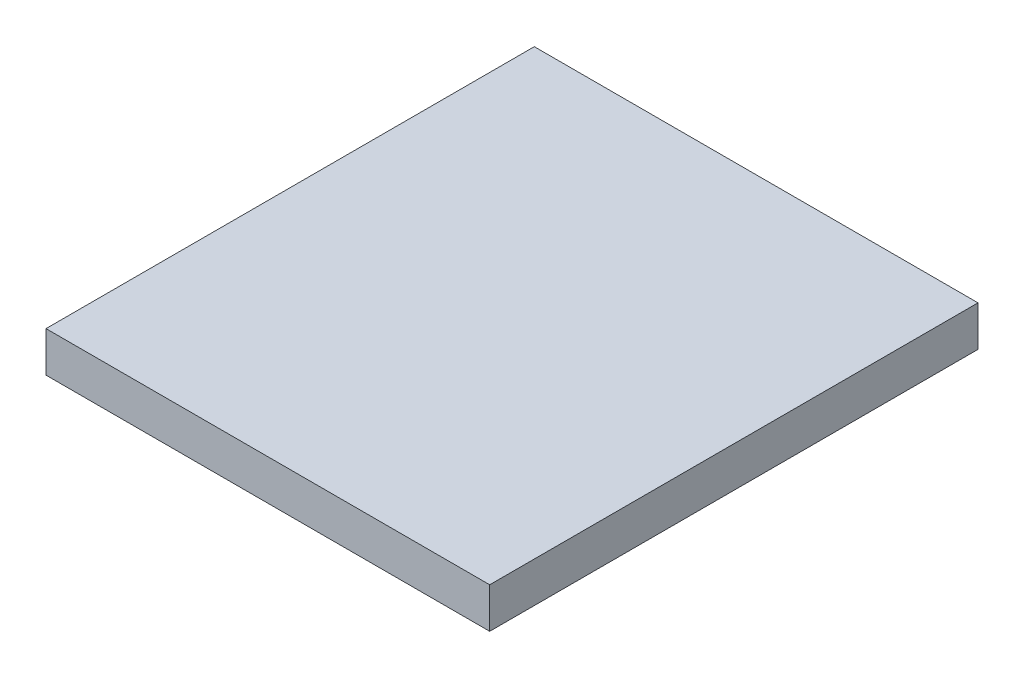
ISO-10303-21;
HEADER;
FILE_DESCRIPTION(('STEP AP214'),'2;1');
FILE_NAME('part.step','',(''),(''),'','','');
FILE_SCHEMA(('AUTOMOTIVE_DESIGN { 1 0 10303 214 1 1 1 1 }'));
ENDSEC;
DATA;
#1=APPLICATION_CONTEXT('core data for automotive mechanical design processes');
#2=APPLICATION_PROTOCOL_DEFINITION('international standard','automotive_design',2000,#1);
#3=PRODUCT_CONTEXT('',#1,'mechanical');
#4=PRODUCT('Part','Part','',(#3));
#5=PRODUCT_RELATED_PRODUCT_CATEGORY('part','',(#4));
#6=PRODUCT_DEFINITION_FORMATION('','',#4);
#7=PRODUCT_DEFINITION_CONTEXT('part definition',#1,'design');
#8=PRODUCT_DEFINITION('design','',#6,#7);
#9=PRODUCT_DEFINITION_SHAPE('','',#8);
#10=(LENGTH_UNIT() NAMED_UNIT(*) SI_UNIT(.MILLI.,.METRE.));
#11=(NAMED_UNIT(*) PLANE_ANGLE_UNIT() SI_UNIT($,.RADIAN.));
#12=(NAMED_UNIT(*) SI_UNIT($,.STERADIAN.) SOLID_ANGLE_UNIT());
#13=UNCERTAINTY_MEASURE_WITH_UNIT(LENGTH_MEASURE(1.E-05),#10,'distance_accuracy_value','');
#14=(GEOMETRIC_REPRESENTATION_CONTEXT(3) GLOBAL_UNCERTAINTY_ASSIGNED_CONTEXT((#13)) GLOBAL_UNIT_ASSIGNED_CONTEXT((#10,
#11,#12)) REPRESENTATION_CONTEXT('',''));
#15=CARTESIAN_POINT('',(0.,0.,0.));
#16=DIRECTION('',(0.,0.,1.));
#17=DIRECTION('',(1.,0.,0.));
#18=AXIS2_PLACEMENT_3D('',#15,#16,#17);
#19=CARTESIAN_POINT('',(54.497363485,9.906,59.977362045));
#20=DIRECTION('',(-1.,0.,0.));
#21=DIRECTION('',(0.,0.,1.));
#22=AXIS2_PLACEMENT_3D('',#19,#20,#21);
#23=PLANE('',#22);
#24=DIRECTION('',(0.,0.,-1.));
#25=VECTOR('',#24,1.);
#26=CARTESIAN_POINT('',(54.497363485,0.,59.977362045));
#27=LINE('',#26,#25);
#28=CARTESIAN_POINT('',(54.497363485,0.,59.977362045));
#29=VERTEX_POINT('',#28);
#30=CARTESIAN_POINT('',(54.497363485,0.,-59.977362045));
#31=VERTEX_POINT('',#30);
#32=EDGE_CURVE('E108',#29,#31,#27,.T.);
#33=ORIENTED_EDGE('',*,*,#32,.T.);
#34=DIRECTION('',(0.,-1.,0.));
#35=VECTOR('',#34,1.);
#36=CARTESIAN_POINT('',(54.497363485,9.906,-59.977362045));
#37=LINE('',#36,#35);
#38=CARTESIAN_POINT('',(54.497363485,9.906,-59.977362045));
#39=VERTEX_POINT('',#38);
#40=EDGE_CURVE('E11',#39,#31,#37,.T.);
#41=ORIENTED_EDGE('',*,*,#40,.F.);
#42=DIRECTION('',(0.,0.,-1.));
#43=VECTOR('',#42,1.);
#44=CARTESIAN_POINT('',(54.497363485,9.906,59.977362045));
#45=LINE('',#44,#43);
#46=CARTESIAN_POINT('',(54.497363485,9.906,59.977362045));
#47=VERTEX_POINT('',#46);
#48=EDGE_CURVE('E96',#47,#39,#45,.T.);
#49=ORIENTED_EDGE('',*,*,#48,.F.);
#50=DIRECTION('',(0.,-1.,0.));
#51=VECTOR('',#50,1.);
#52=CARTESIAN_POINT('',(54.497363485,9.906,59.977362045));
#53=LINE('',#52,#51);
#54=EDGE_CURVE('E104',#47,#29,#53,.T.);
#55=ORIENTED_EDGE('',*,*,#54,.T.);
#56=EDGE_LOOP('',(#33,#41,#49,#55));
#57=FACE_BOUND('',#56,.T.);
#58=ADVANCED_FACE('F45',(#57),#23,.F.);
#59=CARTESIAN_POINT('',(-54.497363485,9.906,-59.977362045));
#60=DIRECTION('',(0.,0.,1.));
#61=DIRECTION('',(1.,0.,0.));
#62=AXIS2_PLACEMENT_3D('',#59,#60,#61);
#63=PLANE('',#62);
#64=DIRECTION('',(-1.,0.,0.));
#65=VECTOR('',#64,1.);
#66=CARTESIAN_POINT('',(-54.497363485,0.,-59.977362045));
#67=LINE('',#66,#65);
#68=CARTESIAN_POINT('',(-54.497363485,0.,-59.977362045));
#69=VERTEX_POINT('',#68);
#70=EDGE_CURVE('E100',#31,#69,#67,.T.);
#71=ORIENTED_EDGE('',*,*,#70,.T.);
#72=DIRECTION('',(0.,-1.,0.));
#73=VECTOR('',#72,1.);
#74=CARTESIAN_POINT('',(-54.497363485,9.906,-59.977362045));
#75=LINE('',#74,#73);
#76=CARTESIAN_POINT('',(-54.497363485,9.906,-59.977362045));
#77=VERTEX_POINT('',#76);
#78=EDGE_CURVE('E53',#77,#69,#75,.T.);
#79=ORIENTED_EDGE('',*,*,#78,.F.);
#80=DIRECTION('',(-1.,0.,0.));
#81=VECTOR('',#80,1.);
#82=CARTESIAN_POINT('',(-54.497363485,9.906,-59.977362045));
#83=LINE('',#82,#81);
#84=EDGE_CURVE('E91',#39,#77,#83,.T.);
#85=ORIENTED_EDGE('',*,*,#84,.F.);
#86=ORIENTED_EDGE('',*,*,#40,.T.);
#87=EDGE_LOOP('',(#71,#79,#85,#86));
#88=FACE_BOUND('',#87,.T.);
#89=ADVANCED_FACE('F99',(#88),#63,.F.);
#90=CARTESIAN_POINT('',(-54.497363485,9.906,59.977362045));
#91=DIRECTION('',(1.,0.,0.));
#92=DIRECTION('',(0.,0.,-1.));
#93=AXIS2_PLACEMENT_3D('',#90,#91,#92);
#94=PLANE('',#93);
#95=DIRECTION('',(0.,0.,1.));
#96=VECTOR('',#95,1.);
#97=CARTESIAN_POINT('',(-54.497363485,0.,59.977362045));
#98=LINE('',#97,#96);
#99=CARTESIAN_POINT('',(-54.497363485,0.,59.977362045));
#100=VERTEX_POINT('',#99);
#101=EDGE_CURVE('E78',#69,#100,#98,.T.);
#102=ORIENTED_EDGE('',*,*,#101,.T.);
#103=DIRECTION('',(0.,-1.,0.));
#104=VECTOR('',#103,1.);
#105=CARTESIAN_POINT('',(-54.497363485,9.906,59.977362045));
#106=LINE('',#105,#104);
#107=CARTESIAN_POINT('',(-54.497363485,9.906,59.977362045));
#108=VERTEX_POINT('',#107);
#109=EDGE_CURVE('E101',#108,#100,#106,.T.);
#110=ORIENTED_EDGE('',*,*,#109,.F.);
#111=DIRECTION('',(0.,0.,1.));
#112=VECTOR('',#111,1.);
#113=CARTESIAN_POINT('',(-54.497363485,9.906,59.977362045));
#114=LINE('',#113,#112);
#115=EDGE_CURVE('E94',#77,#108,#114,.T.);
#116=ORIENTED_EDGE('',*,*,#115,.F.);
#117=ORIENTED_EDGE('',*,*,#78,.T.);
#118=EDGE_LOOP('',(#102,#110,#116,#117));
#119=FACE_BOUND('',#118,.T.);
#120=ADVANCED_FACE('F102',(#119),#94,.F.);
#121=CARTESIAN_POINT('',(-54.497363485,9.906,59.977362045));
#122=DIRECTION('',(0.,0.,-1.));
#123=DIRECTION('',(-1.,0.,0.));
#124=AXIS2_PLACEMENT_3D('',#121,#122,#123);
#125=PLANE('',#124);
#126=DIRECTION('',(1.,0.,0.));
#127=VECTOR('',#126,1.);
#128=CARTESIAN_POINT('',(-54.497363485,0.,59.977362045));
#129=LINE('',#128,#127);
#130=EDGE_CURVE('E84',#100,#29,#129,.T.);
#131=ORIENTED_EDGE('',*,*,#130,.T.);
#132=ORIENTED_EDGE('',*,*,#54,.F.);
#133=DIRECTION('',(1.,0.,0.));
#134=VECTOR('',#133,1.);
#135=CARTESIAN_POINT('',(-54.497363485,9.906,59.977362045));
#136=LINE('',#135,#134);
#137=EDGE_CURVE('E61',#108,#47,#136,.T.);
#138=ORIENTED_EDGE('',*,*,#137,.F.);
#139=ORIENTED_EDGE('',*,*,#109,.T.);
#140=EDGE_LOOP('',(#131,#132,#138,#139));
#141=FACE_BOUND('',#140,.T.);
#142=ADVANCED_FACE('F115',(#141),#125,.F.);
#143=CARTESIAN_POINT('',(0.,9.906,0.));
#144=DIRECTION('',(0.,-1.,0.));
#145=DIRECTION('',(0.,0.,-1.));
#146=AXIS2_PLACEMENT_3D('',#143,#144,#145);
#147=PLANE('',#146);
#148=ORIENTED_EDGE('',*,*,#48,.T.);
#149=ORIENTED_EDGE('',*,*,#84,.T.);
#150=ORIENTED_EDGE('',*,*,#115,.T.);
#151=ORIENTED_EDGE('',*,*,#137,.T.);
#152=EDGE_LOOP('',(#148,#149,#150,#151));
#153=FACE_BOUND('',#152,.T.);
#154=ADVANCED_FACE('F92',(#153),#147,.F.);
#155=CARTESIAN_POINT('',(0.,0.,0.));
#156=DIRECTION('',(0.,-1.,0.));
#157=DIRECTION('',(0.,0.,-1.));
#158=AXIS2_PLACEMENT_3D('',#155,#156,#157);
#159=PLANE('',#158);
#160=ORIENTED_EDGE('',*,*,#32,.F.);
#161=ORIENTED_EDGE('',*,*,#130,.F.);
#162=ORIENTED_EDGE('',*,*,#101,.F.);
#163=ORIENTED_EDGE('',*,*,#70,.F.);
#164=EDGE_LOOP('',(#160,#161,#162,#163));
#165=FACE_BOUND('',#164,.T.);
#166=ADVANCED_FACE('F118',(#165),#159,.T.);
#167=CLOSED_SHELL('',(#58,#89,#120,#142,#154,#166));
#168=MANIFOLD_SOLID_BREP('B2',#167);
#169=ADVANCED_BREP_SHAPE_REPRESENTATION('',(#18,#168),#14);
#170=SHAPE_DEFINITION_REPRESENTATION(#9,#169);
ENDSEC;
END-ISO-10303-21;
